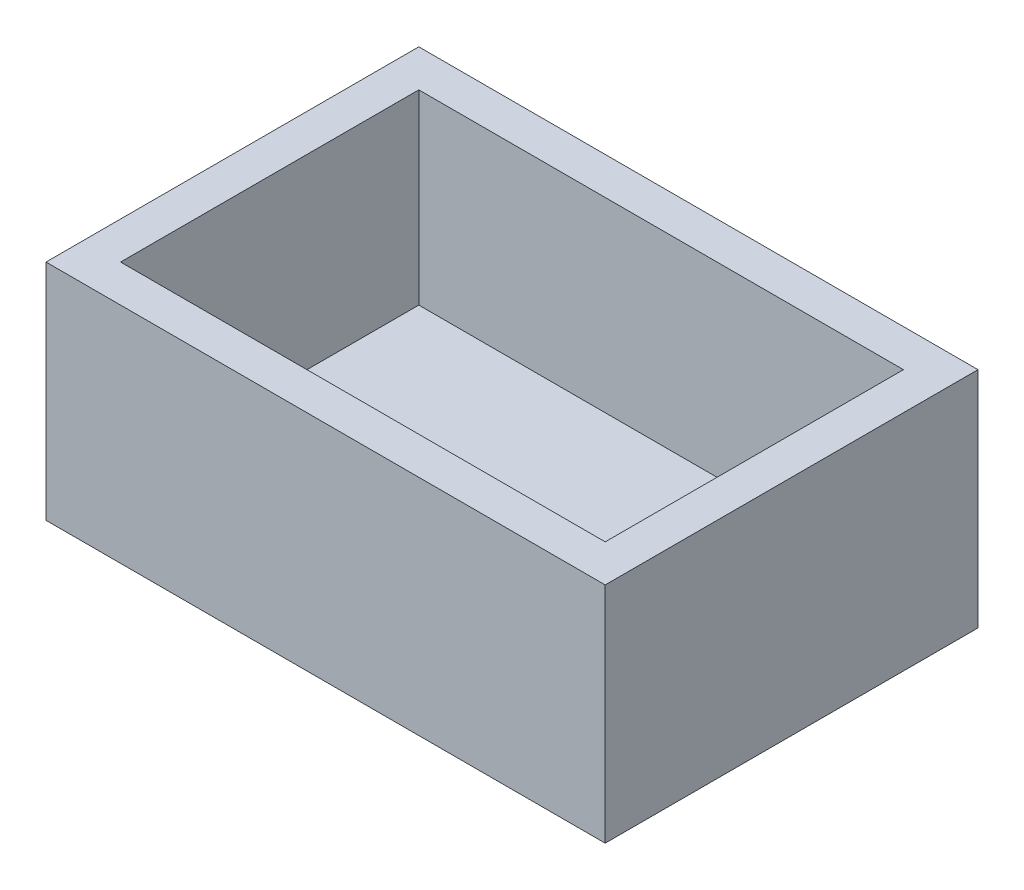
ISO-10303-21;
HEADER;
FILE_DESCRIPTION(('STEP AP214'),'2;1');
FILE_NAME('part.step','',(''),(''),'','','');
FILE_SCHEMA(('AUTOMOTIVE_DESIGN { 1 0 10303 214 1 1 1 1 }'));
ENDSEC;
DATA;
#1=APPLICATION_CONTEXT('core data for automotive mechanical design processes');
#2=APPLICATION_PROTOCOL_DEFINITION('international standard','automotive_design',2000,#1);
#3=PRODUCT_CONTEXT('',#1,'mechanical');
#4=PRODUCT('Part','Part','',(#3));
#5=PRODUCT_RELATED_PRODUCT_CATEGORY('part','',(#4));
#6=PRODUCT_DEFINITION_FORMATION('','',#4);
#7=PRODUCT_DEFINITION_CONTEXT('part definition',#1,'design');
#8=PRODUCT_DEFINITION('design','',#6,#7);
#9=PRODUCT_DEFINITION_SHAPE('','',#8);
#10=(LENGTH_UNIT() NAMED_UNIT(*) SI_UNIT(.MILLI.,.METRE.));
#11=(NAMED_UNIT(*) PLANE_ANGLE_UNIT() SI_UNIT($,.RADIAN.));
#12=(NAMED_UNIT(*) SI_UNIT($,.STERADIAN.) SOLID_ANGLE_UNIT());
#13=UNCERTAINTY_MEASURE_WITH_UNIT(LENGTH_MEASURE(1.E-05),#10,'distance_accuracy_value','');
#14=(GEOMETRIC_REPRESENTATION_CONTEXT(3) GLOBAL_UNCERTAINTY_ASSIGNED_CONTEXT((#13)) GLOBAL_UNIT_ASSIGNED_CONTEXT((#10,
#11,#12)) REPRESENTATION_CONTEXT('',''));
#15=CARTESIAN_POINT('',(0.,0.,0.));
#16=DIRECTION('',(0.,0.,1.));
#17=DIRECTION('',(1.,0.,0.));
#18=AXIS2_PLACEMENT_3D('',#15,#16,#17);
#19=CARTESIAN_POINT('',(75.,60.,-50.));
#20=DIRECTION('',(-1.,0.,0.));
#21=DIRECTION('',(0.,0.,1.));
#22=AXIS2_PLACEMENT_3D('',#19,#20,#21);
#23=PLANE('',#22);
#24=DIRECTION('',(0.,0.,-1.));
#25=VECTOR('',#24,1.);
#26=CARTESIAN_POINT('',(75.,0.,-50.));
#27=LINE('',#26,#25);
#28=CARTESIAN_POINT('',(75.,0.,50.));
#29=VERTEX_POINT('',#28);
#30=CARTESIAN_POINT('',(75.,0.,-50.));
#31=VERTEX_POINT('',#30);
#32=EDGE_CURVE('E145',#29,#31,#27,.T.);
#33=ORIENTED_EDGE('',*,*,#32,.T.);
#34=DIRECTION('',(0.,-1.,0.));
#35=VECTOR('',#34,1.);
#36=CARTESIAN_POINT('',(75.,60.,-50.));
#37=LINE('',#36,#35);
#38=CARTESIAN_POINT('',(75.,60.,-50.));
#39=VERTEX_POINT('',#38);
#40=EDGE_CURVE('E11',#39,#31,#37,.T.);
#41=ORIENTED_EDGE('',*,*,#40,.F.);
#42=DIRECTION('',(0.,0.,-1.));
#43=VECTOR('',#42,1.);
#44=CARTESIAN_POINT('',(75.,60.,-50.));
#45=LINE('',#44,#43);
#46=CARTESIAN_POINT('',(75.,60.,50.));
#47=VERTEX_POINT('',#46);
#48=EDGE_CURVE('E149',#47,#39,#45,.T.);
#49=ORIENTED_EDGE('',*,*,#48,.F.);
#50=DIRECTION('',(0.,-1.,0.));
#51=VECTOR('',#50,1.);
#52=CARTESIAN_POINT('',(75.,60.,50.));
#53=LINE('',#52,#51);
#54=EDGE_CURVE('E155',#47,#29,#53,.T.);
#55=ORIENTED_EDGE('',*,*,#54,.T.);
#56=EDGE_LOOP('',(#33,#41,#49,#55));
#57=FACE_BOUND('',#56,.T.);
#58=ADVANCED_FACE('F37',(#57),#23,.F.);
#59=CARTESIAN_POINT('',(-75.,60.,-50.));
#60=DIRECTION('',(0.,0.,1.));
#61=DIRECTION('',(1.,0.,0.));
#62=AXIS2_PLACEMENT_3D('',#59,#60,#61);
#63=PLANE('',#62);
#64=DIRECTION('',(-1.,0.,0.));
#65=VECTOR('',#64,1.);
#66=CARTESIAN_POINT('',(-75.,0.,-50.));
#67=LINE('',#66,#65);
#68=CARTESIAN_POINT('',(-75.,0.,-50.));
#69=VERTEX_POINT('',#68);
#70=EDGE_CURVE('E158',#31,#69,#67,.T.);
#71=ORIENTED_EDGE('',*,*,#70,.T.);
#72=DIRECTION('',(0.,-1.,0.));
#73=VECTOR('',#72,1.);
#74=CARTESIAN_POINT('',(-75.,60.,-50.));
#75=LINE('',#74,#73);
#76=CARTESIAN_POINT('',(-75.,60.,-50.));
#77=VERTEX_POINT('',#76);
#78=EDGE_CURVE('E44',#77,#69,#75,.T.);
#79=ORIENTED_EDGE('',*,*,#78,.F.);
#80=DIRECTION('',(-1.,0.,0.));
#81=VECTOR('',#80,1.);
#82=CARTESIAN_POINT('',(-75.,60.,-50.));
#83=LINE('',#82,#81);
#84=EDGE_CURVE('E88',#39,#77,#83,.T.);
#85=ORIENTED_EDGE('',*,*,#84,.F.);
#86=ORIENTED_EDGE('',*,*,#40,.T.);
#87=EDGE_LOOP('',(#71,#79,#85,#86));
#88=FACE_BOUND('',#87,.T.);
#89=ADVANCED_FACE('F187',(#88),#63,.F.);
#90=CARTESIAN_POINT('',(-75.,60.,-50.));
#91=DIRECTION('',(1.,0.,0.));
#92=DIRECTION('',(0.,0.,-1.));
#93=AXIS2_PLACEMENT_3D('',#90,#91,#92);
#94=PLANE('',#93);
#95=DIRECTION('',(0.,0.,1.));
#96=VECTOR('',#95,1.);
#97=CARTESIAN_POINT('',(-75.,0.,-50.));
#98=LINE('',#97,#96);
#99=CARTESIAN_POINT('',(-75.,0.,50.));
#100=VERTEX_POINT('',#99);
#101=EDGE_CURVE('E160',#69,#100,#98,.T.);
#102=ORIENTED_EDGE('',*,*,#101,.T.);
#103=DIRECTION('',(0.,-1.,0.));
#104=VECTOR('',#103,1.);
#105=CARTESIAN_POINT('',(-75.,60.,50.));
#106=LINE('',#105,#104);
#107=CARTESIAN_POINT('',(-75.,60.,50.));
#108=VERTEX_POINT('',#107);
#109=EDGE_CURVE('E164',#108,#100,#106,.T.);
#110=ORIENTED_EDGE('',*,*,#109,.F.);
#111=DIRECTION('',(0.,0.,1.));
#112=VECTOR('',#111,1.);
#113=CARTESIAN_POINT('',(-75.,60.,-50.));
#114=LINE('',#113,#112);
#115=EDGE_CURVE('E152',#77,#108,#114,.T.);
#116=ORIENTED_EDGE('',*,*,#115,.F.);
#117=ORIENTED_EDGE('',*,*,#78,.T.);
#118=EDGE_LOOP('',(#102,#110,#116,#117));
#119=FACE_BOUND('',#118,.T.);
#120=ADVANCED_FACE('F169',(#119),#94,.F.);
#121=CARTESIAN_POINT('',(-75.,60.,50.));
#122=DIRECTION('',(0.,0.,-1.));
#123=DIRECTION('',(-1.,0.,0.));
#124=AXIS2_PLACEMENT_3D('',#121,#122,#123);
#125=PLANE('',#124);
#126=DIRECTION('',(1.,0.,0.));
#127=VECTOR('',#126,1.);
#128=CARTESIAN_POINT('',(-75.,0.,50.));
#129=LINE('',#128,#127);
#130=EDGE_CURVE('E81',#100,#29,#129,.T.);
#131=ORIENTED_EDGE('',*,*,#130,.T.);
#132=ORIENTED_EDGE('',*,*,#54,.F.);
#133=DIRECTION('',(1.,0.,0.));
#134=VECTOR('',#133,1.);
#135=CARTESIAN_POINT('',(-75.,60.,50.));
#136=LINE('',#135,#134);
#137=EDGE_CURVE('E60',#108,#47,#136,.T.);
#138=ORIENTED_EDGE('',*,*,#137,.F.);
#139=ORIENTED_EDGE('',*,*,#109,.T.);
#140=EDGE_LOOP('',(#131,#132,#138,#139));
#141=FACE_BOUND('',#140,.T.);
#142=ADVANCED_FACE('F177',(#141),#125,.F.);
#143=CARTESIAN_POINT('',(0.,60.,0.));
#144=DIRECTION('',(0.,1.,0.));
#145=DIRECTION('',(0.,0.,1.));
#146=AXIS2_PLACEMENT_3D('',#143,#144,#145);
#147=PLANE('',#146);
#148=DIRECTION('',(1.,0.,0.));
#149=VECTOR('',#148,1.);
#150=CARTESIAN_POINT('',(-65.,60.,40.));
#151=LINE('',#150,#149);
#152=CARTESIAN_POINT('',(-65.,60.,40.));
#153=VERTEX_POINT('',#152);
#154=CARTESIAN_POINT('',(65.,60.,40.));
#155=VERTEX_POINT('',#154);
#156=EDGE_CURVE('E51',#153,#155,#151,.T.);
#157=ORIENTED_EDGE('',*,*,#156,.F.);
#158=DIRECTION('',(0.,0.,1.));
#159=VECTOR('',#158,1.);
#160=CARTESIAN_POINT('',(-65.,60.,-40.));
#161=LINE('',#160,#159);
#162=CARTESIAN_POINT('',(-65.,60.,-40.));
#163=VERTEX_POINT('',#162);
#164=EDGE_CURVE('E130',#163,#153,#161,.T.);
#165=ORIENTED_EDGE('',*,*,#164,.F.);
#166=DIRECTION('',(-1.,0.,0.));
#167=VECTOR('',#166,1.);
#168=CARTESIAN_POINT('',(65.,60.,-40.));
#169=LINE('',#168,#167);
#170=CARTESIAN_POINT('',(65.,60.,-40.));
#171=VERTEX_POINT('',#170);
#172=EDGE_CURVE('E133',#171,#163,#169,.T.);
#173=ORIENTED_EDGE('',*,*,#172,.F.);
#174=DIRECTION('',(0.,0.,-1.));
#175=VECTOR('',#174,1.);
#176=CARTESIAN_POINT('',(65.,60.,40.));
#177=LINE('',#176,#175);
#178=EDGE_CURVE('E139',#155,#171,#177,.T.);
#179=ORIENTED_EDGE('',*,*,#178,.F.);
#180=EDGE_LOOP('',(#157,#165,#173,#179));
#181=FACE_BOUND('',#180,.T.);
#182=ORIENTED_EDGE('',*,*,#48,.T.);
#183=ORIENTED_EDGE('',*,*,#84,.T.);
#184=ORIENTED_EDGE('',*,*,#115,.T.);
#185=ORIENTED_EDGE('',*,*,#137,.T.);
#186=EDGE_LOOP('',(#182,#183,#184,#185));
#187=FACE_BOUND('',#186,.T.);
#188=ADVANCED_FACE('F179',(#181,#187),#147,.T.);
#189=CARTESIAN_POINT('',(0.,0.,0.));
#190=DIRECTION('',(0.,1.,0.));
#191=DIRECTION('',(0.,0.,1.));
#192=AXIS2_PLACEMENT_3D('',#189,#190,#191);
#193=PLANE('',#192);
#194=ORIENTED_EDGE('',*,*,#32,.F.);
#195=ORIENTED_EDGE('',*,*,#130,.F.);
#196=ORIENTED_EDGE('',*,*,#101,.F.);
#197=ORIENTED_EDGE('',*,*,#70,.F.);
#198=EDGE_LOOP('',(#194,#195,#196,#197));
#199=FACE_BOUND('',#198,.T.);
#200=ADVANCED_FACE('F173',(#199),#193,.F.);
#201=CARTESIAN_POINT('',(-65.,9.99999999999999,40.));
#202=DIRECTION('',(0.,0.,1.));
#203=DIRECTION('',(1.,0.,0.));
#204=AXIS2_PLACEMENT_3D('',#201,#202,#203);
#205=PLANE('',#204);
#206=ORIENTED_EDGE('',*,*,#156,.T.);
#207=DIRECTION('',(0.,1.,0.));
#208=VECTOR('',#207,1.);
#209=CARTESIAN_POINT('',(65.,9.99999999999999,40.));
#210=LINE('',#209,#208);
#211=CARTESIAN_POINT('',(65.,9.99999999999999,40.));
#212=VERTEX_POINT('',#211);
#213=EDGE_CURVE('E108',#212,#155,#210,.T.);
#214=ORIENTED_EDGE('',*,*,#213,.F.);
#215=DIRECTION('',(1.,0.,0.));
#216=VECTOR('',#215,1.);
#217=CARTESIAN_POINT('',(-65.,9.99999999999999,40.));
#218=LINE('',#217,#216);
#219=CARTESIAN_POINT('',(-65.,9.99999999999999,40.));
#220=VERTEX_POINT('',#219);
#221=EDGE_CURVE('E112',#220,#212,#218,.T.);
#222=ORIENTED_EDGE('',*,*,#221,.F.);
#223=DIRECTION('',(0.,1.,0.));
#224=VECTOR('',#223,1.);
#225=CARTESIAN_POINT('',(-65.,9.99999999999999,40.));
#226=LINE('',#225,#224);
#227=EDGE_CURVE('E143',#220,#153,#226,.T.);
#228=ORIENTED_EDGE('',*,*,#227,.T.);
#229=EDGE_LOOP('',(#206,#214,#222,#228));
#230=FACE_BOUND('',#229,.T.);
#231=ADVANCED_FACE('F110',(#230),#205,.F.);
#232=CARTESIAN_POINT('',(-65.,9.99999999999999,-40.));
#233=DIRECTION('',(-1.,0.,0.));
#234=DIRECTION('',(0.,0.,1.));
#235=AXIS2_PLACEMENT_3D('',#232,#233,#234);
#236=PLANE('',#235);
#237=ORIENTED_EDGE('',*,*,#164,.T.);
#238=ORIENTED_EDGE('',*,*,#227,.F.);
#239=DIRECTION('',(0.,0.,1.));
#240=VECTOR('',#239,1.);
#241=CARTESIAN_POINT('',(-65.,9.99999999999999,-40.));
#242=LINE('',#241,#240);
#243=CARTESIAN_POINT('',(-65.,9.99999999999999,-40.));
#244=VERTEX_POINT('',#243);
#245=EDGE_CURVE('E118',#244,#220,#242,.T.);
#246=ORIENTED_EDGE('',*,*,#245,.F.);
#247=DIRECTION('',(0.,1.,0.));
#248=VECTOR('',#247,1.);
#249=CARTESIAN_POINT('',(-65.,9.99999999999999,-40.));
#250=LINE('',#249,#248);
#251=EDGE_CURVE('E146',#244,#163,#250,.T.);
#252=ORIENTED_EDGE('',*,*,#251,.T.);
#253=EDGE_LOOP('',(#237,#238,#246,#252));
#254=FACE_BOUND('',#253,.T.);
#255=ADVANCED_FACE('F226',(#254),#236,.F.);
#256=CARTESIAN_POINT('',(65.,9.99999999999999,-40.));
#257=DIRECTION('',(0.,0.,-1.));
#258=DIRECTION('',(-1.,0.,0.));
#259=AXIS2_PLACEMENT_3D('',#256,#257,#258);
#260=PLANE('',#259);
#261=ORIENTED_EDGE('',*,*,#172,.T.);
#262=ORIENTED_EDGE('',*,*,#251,.F.);
#263=DIRECTION('',(-1.,0.,0.));
#264=VECTOR('',#263,1.);
#265=CARTESIAN_POINT('',(65.,9.99999999999999,-40.));
#266=LINE('',#265,#264);
#267=CARTESIAN_POINT('',(65.,9.99999999999999,-40.));
#268=VERTEX_POINT('',#267);
#269=EDGE_CURVE('E126',#268,#244,#266,.T.);
#270=ORIENTED_EDGE('',*,*,#269,.F.);
#271=DIRECTION('',(0.,1.,0.));
#272=VECTOR('',#271,1.);
#273=CARTESIAN_POINT('',(65.,9.99999999999999,-40.));
#274=LINE('',#273,#272);
#275=EDGE_CURVE('E117',#268,#171,#274,.T.);
#276=ORIENTED_EDGE('',*,*,#275,.T.);
#277=EDGE_LOOP('',(#261,#262,#270,#276));
#278=FACE_BOUND('',#277,.T.);
#279=ADVANCED_FACE('F235',(#278),#260,.F.);
#280=CARTESIAN_POINT('',(65.,9.99999999999999,40.));
#281=DIRECTION('',(1.,0.,0.));
#282=DIRECTION('',(0.,0.,-1.));
#283=AXIS2_PLACEMENT_3D('',#280,#281,#282);
#284=PLANE('',#283);
#285=ORIENTED_EDGE('',*,*,#178,.T.);
#286=ORIENTED_EDGE('',*,*,#275,.F.);
#287=DIRECTION('',(0.,0.,-1.));
#288=VECTOR('',#287,1.);
#289=CARTESIAN_POINT('',(65.,9.99999999999999,40.));
#290=LINE('',#289,#288);
#291=EDGE_CURVE('E121',#212,#268,#290,.T.);
#292=ORIENTED_EDGE('',*,*,#291,.F.);
#293=ORIENTED_EDGE('',*,*,#213,.T.);
#294=EDGE_LOOP('',(#285,#286,#292,#293));
#295=FACE_BOUND('',#294,.T.);
#296=ADVANCED_FACE('F122',(#295),#284,.F.);
#297=CARTESIAN_POINT('',(0.,9.99999999999999,0.));
#298=DIRECTION('',(0.,1.,0.));
#299=DIRECTION('',(0.,0.,1.));
#300=AXIS2_PLACEMENT_3D('',#297,#298,#299);
#301=PLANE('',#300);
#302=ORIENTED_EDGE('',*,*,#221,.T.);
#303=ORIENTED_EDGE('',*,*,#291,.T.);
#304=ORIENTED_EDGE('',*,*,#269,.T.);
#305=ORIENTED_EDGE('',*,*,#245,.T.);
#306=EDGE_LOOP('',(#302,#303,#304,#305));
#307=FACE_BOUND('',#306,.T.);
#308=ADVANCED_FACE('F128',(#307),#301,.T.);
#309=CLOSED_SHELL('',(#58,#89,#120,#142,#188,#200,#231,#255,#279,#296,#308));
#310=MANIFOLD_SOLID_BREP('B2',#309);
#311=ADVANCED_BREP_SHAPE_REPRESENTATION('',(#18,#310),#14);
#312=SHAPE_DEFINITION_REPRESENTATION(#9,#311);
ENDSEC;
END-ISO-10303-21;
